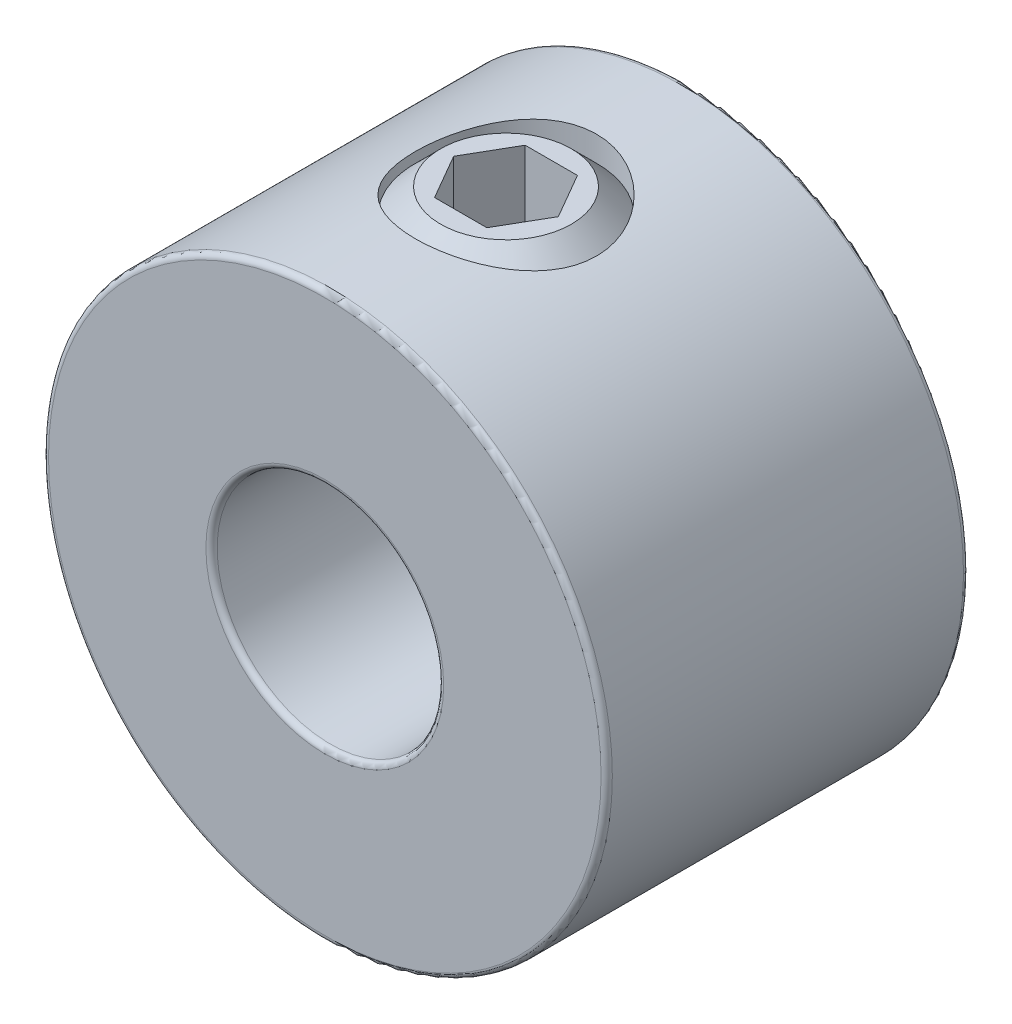
ISO-10303-21;
HEADER;
FILE_DESCRIPTION(('STEP AP214'),'2;1');
FILE_NAME('part.step','',(''),(''),'','','');
FILE_SCHEMA(('AUTOMOTIVE_DESIGN { 1 0 10303 214 1 1 1 1 }'));
ENDSEC;
DATA;
#1=APPLICATION_CONTEXT('core data for automotive mechanical design processes');
#2=APPLICATION_PROTOCOL_DEFINITION('international standard','automotive_design',2000,#1);
#3=PRODUCT_CONTEXT('',#1,'mechanical');
#4=PRODUCT('Part','Part','',(#3));
#5=PRODUCT_RELATED_PRODUCT_CATEGORY('part','',(#4));
#6=PRODUCT_DEFINITION_FORMATION('','',#4);
#7=PRODUCT_DEFINITION_CONTEXT('part definition',#1,'design');
#8=PRODUCT_DEFINITION('design','',#6,#7);
#9=PRODUCT_DEFINITION_SHAPE('','',#8);
#10=(LENGTH_UNIT() NAMED_UNIT(*) SI_UNIT(.MILLI.,.METRE.));
#11=(NAMED_UNIT(*) PLANE_ANGLE_UNIT() SI_UNIT($,.RADIAN.));
#12=(NAMED_UNIT(*) SI_UNIT($,.STERADIAN.) SOLID_ANGLE_UNIT());
#13=UNCERTAINTY_MEASURE_WITH_UNIT(LENGTH_MEASURE(1.E-05),#10,'distance_accuracy_value','');
#14=(GEOMETRIC_REPRESENTATION_CONTEXT(3) GLOBAL_UNCERTAINTY_ASSIGNED_CONTEXT((#13)) GLOBAL_UNIT_ASSIGNED_CONTEXT((#10,
#11,#12)) REPRESENTATION_CONTEXT('',''));
#15=CARTESIAN_POINT('',(0.,0.,0.));
#16=DIRECTION('',(0.,0.,1.));
#17=DIRECTION('',(1.,0.,0.));
#18=AXIS2_PLACEMENT_3D('',#15,#16,#17);
#19=CARTESIAN_POINT('',(0.,2.77962432702595,4.));
#20=DIRECTION('',(0.,1.,0.));
#21=DIRECTION('',(-1.,0.,0.));
#22=AXIS2_PLACEMENT_3D('',#19,#20,#21);
#23=CONICAL_SURFACE('',#22,2.,0.785398163397447);
#24=CARTESIAN_POINT('',(0.,2.223,4.));
#25=DIRECTION('',(0.,-1.,0.));
#26=DIRECTION('',(1.,0.,0.));
#27=AXIS2_PLACEMENT_3D('',#24,#25,#26);
#28=CIRCLE('',#27,1.44337567297406);
#29=CARTESIAN_POINT('',(1.44337567297406,2.223,4.));
#30=VERTEX_POINT('',#29);
#31=EDGE_CURVE('E12',#30,#30,#28,.T.);
#32=ORIENTED_EDGE('',*,*,#31,.F.);
#33=EDGE_LOOP('',(#32));
#34=FACE_BOUND('',#33,.T.);
#35=CARTESIAN_POINT('',(0.,2.77962432702595,4.));
#36=DIRECTION('',(0.,-1.,0.));
#37=DIRECTION('',(1.,0.,0.));
#38=AXIS2_PLACEMENT_3D('',#35,#36,#37);
#39=CIRCLE('',#38,2.);
#40=CARTESIAN_POINT('',(2.,2.77962432702595,4.));
#41=VERTEX_POINT('',#40);
#42=EDGE_CURVE('E143',#41,#41,#39,.T.);
#43=ORIENTED_EDGE('',*,*,#42,.T.);
#44=EDGE_LOOP('',(#43));
#45=FACE_BOUND('',#44,.T.);
#46=ADVANCED_FACE('F44',(#34,#45),#23,.T.);
#47=CARTESIAN_POINT('',(-0.5,2.223,4.));
#48=DIRECTION('',(0.,1.,0.));
#49=DIRECTION('',(-1.,0.,0.));
#50=AXIS2_PLACEMENT_3D('',#47,#48,#49);
#51=PLANE('',#50);
#52=CARTESIAN_POINT('',(0.,2.223,4.));
#53=DIRECTION('',(0.,-1.,0.));
#54=DIRECTION('',(1.,0.,0.));
#55=AXIS2_PLACEMENT_3D('',#52,#53,#54);
#56=CIRCLE('',#55,0.5);
#57=CARTESIAN_POINT('',(0.5,2.223,4.));
#58=VERTEX_POINT('',#57);
#59=EDGE_CURVE('E51',#58,#58,#56,.T.);
#60=ORIENTED_EDGE('',*,*,#59,.F.);
#61=EDGE_LOOP('',(#60));
#62=FACE_BOUND('',#61,.T.);
#63=ORIENTED_EDGE('',*,*,#31,.T.);
#64=EDGE_LOOP('',(#63));
#65=FACE_BOUND('',#64,.T.);
#66=ADVANCED_FACE('F163',(#62,#65),#51,.F.);
#67=CARTESIAN_POINT('',(0.,2.223,4.));
#68=DIRECTION('',(0.,-1.,0.));
#69=DIRECTION('',(1.,0.,0.));
#70=AXIS2_PLACEMENT_3D('',#67,#68,#69);
#71=CONICAL_SURFACE('',#70,0.5,0.523598775598296);
#72=CARTESIAN_POINT('',(0.,3.08902540378444,4.));
#73=VERTEX_POINT('',#72);
#74=VERTEX_LOOP('',#73);
#75=FACE_BOUND('',#74,.T.);
#76=ORIENTED_EDGE('',*,*,#59,.T.);
#77=EDGE_LOOP('',(#76));
#78=FACE_BOUND('',#77,.T.);
#79=ADVANCED_FACE('F161',(#75,#78),#71,.F.);
#80=CARTESIAN_POINT('',(0.,6.223,4.));
#81=DIRECTION('',(0.,-1.,0.));
#82=DIRECTION('',(1.,0.,0.));
#83=AXIS2_PLACEMENT_3D('',#80,#81,#82);
#84=PLANE('',#83);
#85=DIRECTION('',(0.5,0.,0.866025403784439));
#86=VECTOR('',#85,1.);
#87=CARTESIAN_POINT('',(-1.15470053837924,6.223,4.));
#88=LINE('',#87,#86);
#89=CARTESIAN_POINT('',(-1.15470053837923,6.223,4.));
#90=VERTEX_POINT('',#89);
#91=CARTESIAN_POINT('',(-0.577350269189609,6.223,5.));
#92=VERTEX_POINT('',#91);
#93=EDGE_CURVE('E131',#90,#92,#88,.T.);
#94=ORIENTED_EDGE('',*,*,#93,.F.);
#95=DIRECTION('',(-0.499999999999999,0.,0.866025403784439));
#96=VECTOR('',#95,1.);
#97=CARTESIAN_POINT('',(-0.57735026918961,6.223,3.));
#98=LINE('',#97,#96);
#99=CARTESIAN_POINT('',(-0.57735026918961,6.223,3.));
#100=VERTEX_POINT('',#99);
#101=EDGE_CURVE('E58',#100,#90,#98,.T.);
#102=ORIENTED_EDGE('',*,*,#101,.F.);
#103=DIRECTION('',(-1.,0.,0.));
#104=VECTOR('',#103,1.);
#105=CARTESIAN_POINT('',(0.577350269189642,6.223,3.));
#106=LINE('',#105,#104);
#107=CARTESIAN_POINT('',(0.577350269189642,6.223,3.));
#108=VERTEX_POINT('',#107);
#109=EDGE_CURVE('E117',#108,#100,#106,.T.);
#110=ORIENTED_EDGE('',*,*,#109,.F.);
#111=DIRECTION('',(-0.5,0.,-0.866025403784439));
#112=VECTOR('',#111,1.);
#113=CARTESIAN_POINT('',(1.15470053837927,6.223,4.));
#114=LINE('',#113,#112);
#115=CARTESIAN_POINT('',(1.15470053837927,6.223,4.));
#116=VERTEX_POINT('',#115);
#117=EDGE_CURVE('E120',#116,#108,#114,.T.);
#118=ORIENTED_EDGE('',*,*,#117,.F.);
#119=DIRECTION('',(0.499999999999999,0.,-0.866025403784439));
#120=VECTOR('',#119,1.);
#121=CARTESIAN_POINT('',(0.577350269189643,6.223,5.));
#122=LINE('',#121,#120);
#123=CARTESIAN_POINT('',(0.577350269189643,6.223,5.));
#124=VERTEX_POINT('',#123);
#125=EDGE_CURVE('E136',#124,#116,#122,.T.);
#126=ORIENTED_EDGE('',*,*,#125,.F.);
#127=DIRECTION('',(1.,0.,0.));
#128=VECTOR('',#127,1.);
#129=CARTESIAN_POINT('',(-0.577350269189609,6.223,5.));
#130=LINE('',#129,#128);
#131=EDGE_CURVE('E133',#92,#124,#130,.T.);
#132=ORIENTED_EDGE('',*,*,#131,.F.);
#133=EDGE_LOOP('',(#94,#102,#110,#118,#126,#132));
#134=FACE_BOUND('',#133,.T.);
#135=CARTESIAN_POINT('',(0.,6.223,4.));
#136=DIRECTION('',(0.,-1.,0.));
#137=DIRECTION('',(1.,0.,0.));
#138=AXIS2_PLACEMENT_3D('',#135,#136,#137);
#139=CIRCLE('',#138,1.44337567297406);
#140=CARTESIAN_POINT('',(1.44337567297406,6.223,4.));
#141=VERTEX_POINT('',#140);
#142=EDGE_CURVE('E156',#141,#141,#139,.T.);
#143=ORIENTED_EDGE('',*,*,#142,.F.);
#144=EDGE_LOOP('',(#143));
#145=FACE_BOUND('',#144,.T.);
#146=ADVANCED_FACE('F181',(#134,#145),#84,.F.);
#147=CARTESIAN_POINT('',(0.,6.223,4.));
#148=DIRECTION('',(0.,-1.,0.));
#149=DIRECTION('',(1.,0.,0.));
#150=AXIS2_PLACEMENT_3D('',#147,#148,#149);
#151=CONICAL_SURFACE('',#150,1.44337567297406,0.785398163397446);
#152=CARTESIAN_POINT('',(0.,5.66637567297405,4.));
#153=DIRECTION('',(0.,-1.,0.));
#154=DIRECTION('',(1.,0.,0.));
#155=AXIS2_PLACEMENT_3D('',#152,#153,#154);
#156=CIRCLE('',#155,2.);
#157=CARTESIAN_POINT('',(2.,5.66637567297405,4.));
#158=VERTEX_POINT('',#157);
#159=EDGE_CURVE('E153',#158,#158,#156,.T.);
#160=ORIENTED_EDGE('',*,*,#159,.F.);
#161=EDGE_LOOP('',(#160));
#162=FACE_BOUND('',#161,.T.);
#163=ORIENTED_EDGE('',*,*,#142,.T.);
#164=EDGE_LOOP('',(#163));
#165=FACE_BOUND('',#164,.T.);
#166=ADVANCED_FACE('F175',(#162,#165),#151,.T.);
#167=CARTESIAN_POINT('',(0.,3.08902540378444,4.));
#168=DIRECTION('',(0.,-1.,0.));
#169=DIRECTION('',(1.,0.,0.));
#170=AXIS2_PLACEMENT_3D('',#167,#168,#169);
#171=CYLINDRICAL_SURFACE('',#170,2.);
#172=ORIENTED_EDGE('',*,*,#42,.F.);
#173=EDGE_LOOP('',(#172));
#174=FACE_BOUND('',#173,.T.);
#175=ORIENTED_EDGE('',*,*,#159,.T.);
#176=EDGE_LOOP('',(#175));
#177=FACE_BOUND('',#176,.T.);
#178=ADVANCED_FACE('F172',(#174,#177),#171,.T.);
#179=CARTESIAN_POINT('',(-0.57735026918961,4.623,3.));
#180=DIRECTION('',(-0.866025403784439,0.,-0.5));
#181=DIRECTION('',(-0.5,0.,0.866025403784439));
#182=AXIS2_PLACEMENT_3D('',#179,#180,#181);
#183=PLANE('',#182);
#184=ORIENTED_EDGE('',*,*,#101,.T.);
#185=DIRECTION('',(0.,1.,0.));
#186=VECTOR('',#185,1.);
#187=CARTESIAN_POINT('',(-1.15470053837923,4.623,4.));
#188=LINE('',#187,#186);
#189=CARTESIAN_POINT('',(-1.15470053837923,4.623,4.));
#190=VERTEX_POINT('',#189);
#191=EDGE_CURVE('E94',#190,#90,#188,.T.);
#192=ORIENTED_EDGE('',*,*,#191,.F.);
#193=DIRECTION('',(-0.499999999999999,0.,0.866025403784439));
#194=VECTOR('',#193,1.);
#195=CARTESIAN_POINT('',(-0.57735026918961,4.623,3.));
#196=LINE('',#195,#194);
#197=CARTESIAN_POINT('',(-0.57735026918961,4.623,3.));
#198=VERTEX_POINT('',#197);
#199=EDGE_CURVE('E98',#198,#190,#196,.T.);
#200=ORIENTED_EDGE('',*,*,#199,.F.);
#201=DIRECTION('',(0.,1.,0.));
#202=VECTOR('',#201,1.);
#203=CARTESIAN_POINT('',(-0.57735026918961,4.623,3.));
#204=LINE('',#203,#202);
#205=EDGE_CURVE('E141',#198,#100,#204,.T.);
#206=ORIENTED_EDGE('',*,*,#205,.T.);
#207=EDGE_LOOP('',(#184,#192,#200,#206));
#208=FACE_BOUND('',#207,.T.);
#209=ADVANCED_FACE('F96',(#208),#183,.F.);
#210=CARTESIAN_POINT('',(0.577350269189642,4.623,3.));
#211=DIRECTION('',(0.,0.,-1.));
#212=DIRECTION('',(-1.,0.,0.));
#213=AXIS2_PLACEMENT_3D('',#210,#211,#212);
#214=PLANE('',#213);
#215=ORIENTED_EDGE('',*,*,#109,.T.);
#216=ORIENTED_EDGE('',*,*,#205,.F.);
#217=DIRECTION('',(-1.,0.,0.));
#218=VECTOR('',#217,1.);
#219=CARTESIAN_POINT('',(0.577350269189642,4.623,3.));
#220=LINE('',#219,#218);
#221=CARTESIAN_POINT('',(0.577350269189642,4.623,3.));
#222=VERTEX_POINT('',#221);
#223=EDGE_CURVE('E104',#222,#198,#220,.T.);
#224=ORIENTED_EDGE('',*,*,#223,.F.);
#225=DIRECTION('',(0.,1.,0.));
#226=VECTOR('',#225,1.);
#227=CARTESIAN_POINT('',(0.577350269189642,4.623,3.));
#228=LINE('',#227,#226);
#229=EDGE_CURVE('E144',#222,#108,#228,.T.);
#230=ORIENTED_EDGE('',*,*,#229,.T.);
#231=EDGE_LOOP('',(#215,#216,#224,#230));
#232=FACE_BOUND('',#231,.T.);
#233=ADVANCED_FACE('F195',(#232),#214,.F.);
#234=CARTESIAN_POINT('',(1.15470053837927,4.623,4.));
#235=DIRECTION('',(0.866025403784438,0.,-0.5));
#236=DIRECTION('',(-0.5,0.,-0.866025403784438));
#237=AXIS2_PLACEMENT_3D('',#234,#235,#236);
#238=PLANE('',#237);
#239=ORIENTED_EDGE('',*,*,#117,.T.);
#240=ORIENTED_EDGE('',*,*,#229,.F.);
#241=DIRECTION('',(-0.5,0.,-0.866025403784439));
#242=VECTOR('',#241,1.);
#243=CARTESIAN_POINT('',(1.15470053837927,4.623,4.));
#244=LINE('',#243,#242);
#245=CARTESIAN_POINT('',(1.15470053837927,4.623,4.));
#246=VERTEX_POINT('',#245);
#247=EDGE_CURVE('E127',#246,#222,#244,.T.);
#248=ORIENTED_EDGE('',*,*,#247,.F.);
#249=DIRECTION('',(0.,1.,0.));
#250=VECTOR('',#249,1.);
#251=CARTESIAN_POINT('',(1.15470053837927,4.623,4.));
#252=LINE('',#251,#250);
#253=EDGE_CURVE('E146',#246,#116,#252,.T.);
#254=ORIENTED_EDGE('',*,*,#253,.T.);
#255=EDGE_LOOP('',(#239,#240,#248,#254));
#256=FACE_BOUND('',#255,.T.);
#257=ADVANCED_FACE('F205',(#256),#238,.F.);
#258=CARTESIAN_POINT('',(0.577350269189643,4.623,5.));
#259=DIRECTION('',(0.866025403784439,0.,0.499999999999999));
#260=DIRECTION('',(0.499999999999999,0.,-0.866025403784439));
#261=AXIS2_PLACEMENT_3D('',#258,#259,#260);
#262=PLANE('',#261);
#263=ORIENTED_EDGE('',*,*,#125,.T.);
#264=ORIENTED_EDGE('',*,*,#253,.F.);
#265=DIRECTION('',(0.499999999999999,0.,-0.866025403784439));
#266=VECTOR('',#265,1.);
#267=CARTESIAN_POINT('',(0.577350269189643,4.623,5.));
#268=LINE('',#267,#266);
#269=CARTESIAN_POINT('',(0.577350269189643,4.623,5.));
#270=VERTEX_POINT('',#269);
#271=EDGE_CURVE('E124',#270,#246,#268,.T.);
#272=ORIENTED_EDGE('',*,*,#271,.F.);
#273=DIRECTION('',(0.,1.,0.));
#274=VECTOR('',#273,1.);
#275=CARTESIAN_POINT('',(0.577350269189643,4.623,5.));
#276=LINE('',#275,#274);
#277=EDGE_CURVE('E148',#270,#124,#276,.T.);
#278=ORIENTED_EDGE('',*,*,#277,.T.);
#279=EDGE_LOOP('',(#263,#264,#272,#278));
#280=FACE_BOUND('',#279,.T.);
#281=ADVANCED_FACE('F201',(#280),#262,.F.);
#282=CARTESIAN_POINT('',(-0.577350269189609,4.623,5.));
#283=DIRECTION('',(0.,0.,1.));
#284=DIRECTION('',(1.,0.,0.));
#285=AXIS2_PLACEMENT_3D('',#282,#283,#284);
#286=PLANE('',#285);
#287=ORIENTED_EDGE('',*,*,#131,.T.);
#288=ORIENTED_EDGE('',*,*,#277,.F.);
#289=DIRECTION('',(1.,0.,0.));
#290=VECTOR('',#289,1.);
#291=CARTESIAN_POINT('',(-0.577350269189609,4.623,5.));
#292=LINE('',#291,#290);
#293=CARTESIAN_POINT('',(-0.577350269189609,4.623,5.));
#294=VERTEX_POINT('',#293);
#295=EDGE_CURVE('E112',#294,#270,#292,.T.);
#296=ORIENTED_EDGE('',*,*,#295,.F.);
#297=DIRECTION('',(0.,1.,0.));
#298=VECTOR('',#297,1.);
#299=CARTESIAN_POINT('',(-0.577350269189609,4.623,5.));
#300=LINE('',#299,#298);
#301=EDGE_CURVE('E103',#294,#92,#300,.T.);
#302=ORIENTED_EDGE('',*,*,#301,.T.);
#303=EDGE_LOOP('',(#287,#288,#296,#302));
#304=FACE_BOUND('',#303,.T.);
#305=ADVANCED_FACE('F198',(#304),#286,.F.);
#306=CARTESIAN_POINT('',(-1.15470053837923,4.623,4.));
#307=DIRECTION('',(-0.866025403784439,0.,0.5));
#308=DIRECTION('',(0.5,0.,0.866025403784439));
#309=AXIS2_PLACEMENT_3D('',#306,#307,#308);
#310=PLANE('',#309);
#311=ORIENTED_EDGE('',*,*,#93,.T.);
#312=ORIENTED_EDGE('',*,*,#301,.F.);
#313=DIRECTION('',(0.5,0.,0.866025403784439));
#314=VECTOR('',#313,1.);
#315=CARTESIAN_POINT('',(-1.15470053837923,4.623,4.));
#316=LINE('',#315,#314);
#317=EDGE_CURVE('E107',#190,#294,#316,.T.);
#318=ORIENTED_EDGE('',*,*,#317,.F.);
#319=ORIENTED_EDGE('',*,*,#191,.T.);
#320=EDGE_LOOP('',(#311,#312,#318,#319));
#321=FACE_BOUND('',#320,.T.);
#322=ADVANCED_FACE('F108',(#321),#310,.F.);
#323=CARTESIAN_POINT('',(-0.57735026918961,4.623,3.));
#324=DIRECTION('',(0.,-1.,0.));
#325=DIRECTION('',(0.,0.,-1.));
#326=AXIS2_PLACEMENT_3D('',#323,#324,#325);
#327=PLANE('',#326);
#328=ORIENTED_EDGE('',*,*,#199,.T.);
#329=ORIENTED_EDGE('',*,*,#317,.T.);
#330=ORIENTED_EDGE('',*,*,#295,.T.);
#331=ORIENTED_EDGE('',*,*,#271,.T.);
#332=ORIENTED_EDGE('',*,*,#247,.T.);
#333=ORIENTED_EDGE('',*,*,#223,.T.);
#334=EDGE_LOOP('',(#328,#329,#330,#331,#332,#333));
#335=FACE_BOUND('',#334,.T.);
#336=ADVANCED_FACE('F114',(#335),#327,.F.);
#337=CLOSED_SHELL('',(#46,#66,#79,#146,#166,#178,#209,#233,#257,#281,#305,#322,#336));
#338=MANIFOLD_SOLID_BREP('B2',#337);
#339=CARTESIAN_POINT('',(0.,0.,8.));
#340=DIRECTION('',(0.,0.,1.));
#341=DIRECTION('',(1.,0.,0.));
#342=AXIS2_PLACEMENT_3D('',#339,#340,#341);
#343=PLANE('',#342);
#344=CARTESIAN_POINT('',(0.,0.,8.));
#345=DIRECTION('',(0.,0.,1.));
#346=DIRECTION('',(1.,0.,0.));
#347=AXIS2_PLACEMENT_3D('',#344,#345,#346);
#348=CIRCLE('',#347,2.62446);
#349=CARTESIAN_POINT('',(2.62446,0.,8.));
#350=VERTEX_POINT('',#349);
#351=EDGE_CURVE('E309',#350,#350,#348,.F.);
#352=ORIENTED_EDGE('',*,*,#351,.T.);
#353=EDGE_LOOP('',(#352));
#354=FACE_BOUND('',#353,.T.);
#355=CARTESIAN_POINT('',(0.,0.,8.));
#356=DIRECTION('',(0.,0.,1.));
#357=DIRECTION('',(1.,0.,0.));
#358=AXIS2_PLACEMENT_3D('',#355,#356,#357);
#359=CIRCLE('',#358,6.09854);
#360=CARTESIAN_POINT('',(6.09854,0.,8.));
#361=VERTEX_POINT('',#360);
#362=EDGE_CURVE('E313',#361,#361,#359,.T.);
#363=ORIENTED_EDGE('',*,*,#362,.T.);
#364=EDGE_LOOP('',(#363));
#365=FACE_BOUND('',#364,.T.);
#366=ADVANCED_FACE('F298',(#354,#365),#343,.T.);
#367=CARTESIAN_POINT('',(0.,0.,0.));
#368=DIRECTION('',(0.,0.,1.));
#369=DIRECTION('',(1.,0.,0.));
#370=AXIS2_PLACEMENT_3D('',#367,#368,#369);
#371=PLANE('',#370);
#372=CARTESIAN_POINT('',(0.,0.,0.));
#373=DIRECTION('',(0.,0.,1.));
#374=DIRECTION('',(1.,0.,0.));
#375=AXIS2_PLACEMENT_3D('',#372,#373,#374);
#376=CIRCLE('',#375,2.62446);
#377=CARTESIAN_POINT('',(2.62446,0.,0.));
#378=VERTEX_POINT('',#377);
#379=EDGE_CURVE('E324',#378,#378,#376,.T.);
#380=ORIENTED_EDGE('',*,*,#379,.T.);
#381=EDGE_LOOP('',(#380));
#382=FACE_BOUND('',#381,.T.);
#383=CARTESIAN_POINT('',(0.,0.,0.));
#384=DIRECTION('',(0.,0.,1.));
#385=DIRECTION('',(1.,0.,0.));
#386=AXIS2_PLACEMENT_3D('',#383,#384,#385);
#387=CIRCLE('',#386,6.09854);
#388=CARTESIAN_POINT('',(6.09854,0.,0.));
#389=VERTEX_POINT('',#388);
#390=EDGE_CURVE('E327',#389,#389,#387,.F.);
#391=ORIENTED_EDGE('',*,*,#390,.T.);
#392=EDGE_LOOP('',(#391));
#393=FACE_BOUND('',#392,.T.);
#394=ADVANCED_FACE('F363',(#382,#393),#371,.F.);
#395=CARTESIAN_POINT('',(0.,0.,8.));
#396=DIRECTION('',(0.,0.,-1.));
#397=DIRECTION('',(-1.,0.,0.));
#398=AXIS2_PLACEMENT_3D('',#395,#396,#397);
#399=CYLINDRICAL_SURFACE('',#398,6.223);
#400=CARTESIAN_POINT('',(0.,0.,0.12446));
#401=DIRECTION('',(0.,0.,1.));
#402=DIRECTION('',(1.,0.,0.));
#403=AXIS2_PLACEMENT_3D('',#400,#401,#402);
#404=CIRCLE('',#403,6.223);
#405=CARTESIAN_POINT('',(6.223,0.,0.12446));
#406=VERTEX_POINT('',#405);
#407=EDGE_CURVE('E43',#406,#406,#404,.T.);
#408=ORIENTED_EDGE('',*,*,#407,.T.);
#409=EDGE_LOOP('',(#408));
#410=FACE_BOUND('',#409,.T.);
#411=CARTESIAN_POINT('',(0.,0.,7.87554));
#412=DIRECTION('',(0.,0.,1.));
#413=DIRECTION('',(1.,0.,0.));
#414=AXIS2_PLACEMENT_3D('',#411,#412,#413);
#415=CIRCLE('',#414,6.223);
#416=CARTESIAN_POINT('',(6.223,0.,7.87554));
#417=VERTEX_POINT('',#416);
#418=EDGE_CURVE('E305',#417,#417,#415,.F.);
#419=ORIENTED_EDGE('',*,*,#418,.T.);
#420=EDGE_LOOP('',(#419));
#421=FACE_BOUND('',#420,.T.);
#422=CARTESIAN_POINT('',(0.,6.223,6.));
#423=CARTESIAN_POINT('',(-0.109344849387394,6.22299978665975,5.99999977489798));
#424=CARTESIAN_POINT('',(-0.218692781459291,6.22009109658988,5.99100337974367));
#425=CARTESIAN_POINT('',(-0.434181119214258,6.20877335976124,5.95535642030831));
#426=CARTESIAN_POINT('',(-0.540320962100901,6.20036335369662,5.92870277698979));
#427=CARTESIAN_POINT('',(-0.746254978622004,6.1789596626439,5.85873994432626));
#428=CARTESIAN_POINT('',(-0.846059010569927,6.16597331538662,5.81545740787444));
#429=CARTESIAN_POINT('',(-1.03699231563419,6.13675133033008,5.71358179636808));
#430=CARTESIAN_POINT('',(-1.1281200691614,6.12051512488019,5.65498604601711));
#431=CARTESIAN_POINT('',(-1.30207297370357,6.0859210774888,5.5221465807667));
#432=CARTESIAN_POINT('',(-1.38457714427325,6.0675150546903,5.44749514840338));
#433=CARTESIAN_POINT('',(-1.53613652010488,6.03092896493063,5.28553095686524));
#434=CARTESIAN_POINT('',(-1.60518903518519,6.01274894384648,5.19821567113903));
#435=CARTESIAN_POINT('',(-1.72966365707208,5.97815081340535,5.01057717812555));
#436=CARTESIAN_POINT('',(-1.7846779782155,5.96179186028481,4.90997150640143));
#437=CARTESIAN_POINT('',(-1.87687143886454,5.93341607723041,4.70032532074543));
#438=CARTESIAN_POINT('',(-1.91405558617863,5.92139802833815,4.59128718517059));
#439=CARTESIAN_POINT('',(-1.96834620759713,5.90357015871789,4.37150543613034));
#440=CARTESIAN_POINT('',(-1.98605068469726,5.897575949991,4.26092492640225));
#441=CARTESIAN_POINT('',(-2.00274819155342,5.89192783603369,4.03821305027479));
#442=CARTESIAN_POINT('',(-2.00174652862507,5.89227213243896,3.92608213277974));
#443=CARTESIAN_POINT('',(-1.98152647016485,5.89909985971348,3.70846247800211));
#444=CARTESIAN_POINT('',(-1.96307660467359,5.90532428000246,3.60289282093613));
#445=CARTESIAN_POINT('',(-1.90973314310699,5.92278886975907,3.39643507576891));
#446=CARTESIAN_POINT('',(-1.87483770722923,5.93402960040499,3.29554751285143));
#447=CARTESIAN_POINT('',(-1.78906771992137,5.96045286559087,3.09952266256469));
#448=CARTESIAN_POINT('',(-1.73795759323903,5.97569290066602,3.00449653495315));
#449=CARTESIAN_POINT('',(-1.62137261125317,6.00837220988546,2.82412128294526));
#450=CARTESIAN_POINT('',(-1.55589384607131,6.02581208208146,2.73877480210341));
#451=CARTESIAN_POINT('',(-1.40869268058695,6.0619567090307,2.57584752591708));
#452=CARTESIAN_POINT('',(-1.32633837009025,6.08068186818455,2.49884107433293));
#453=CARTESIAN_POINT('',(-1.14965263495116,6.11654669168167,2.35958789463478));
#454=CARTESIAN_POINT('',(-1.05532021868844,6.13368622455387,2.2973423897464));
#455=CARTESIAN_POINT('',(-0.856202618565597,6.16464687190223,2.18895851923819));
#456=CARTESIAN_POINT('',(-0.751334039550079,6.1784379845121,2.1429642096328));
#457=CARTESIAN_POINT('',(-0.534800588905156,6.20093089011386,2.06944318767513));
#458=CARTESIAN_POINT('',(-0.423137917751001,6.20963432132187,2.04191053031311));
#459=CARTESIAN_POINT('',(-0.20105571330985,6.22070434172252,2.00708911128014));
#460=CARTESIAN_POINT('',(-0.0907699380851832,6.22331398201422,1.99902344190777));
#461=CARTESIAN_POINT('',(0.129595004935171,6.22262546087284,2.0011649855979));
#462=CARTESIAN_POINT('',(0.239674202193011,6.21932821808903,2.01136935727004));
#463=CARTESIAN_POINT('',(0.453457311369077,6.20735646707694,2.04914122000944));
#464=CARTESIAN_POINT('',(0.557252898253722,6.19882711502416,2.07624031580869));
#465=CARTESIAN_POINT('',(0.758790022637197,6.17739795702758,2.14645495310528));
#466=CARTESIAN_POINT('',(0.856530798884324,6.16449760284564,2.18957250380183));
#467=CARTESIAN_POINT('',(1.04592864213888,6.13524101916694,2.29181195213402));
#468=CARTESIAN_POINT('',(1.13737004478324,6.11880582110077,2.35131013660381));
#469=CARTESIAN_POINT('',(1.30922810542511,6.08435252006076,2.4841744984242));
#470=CARTESIAN_POINT('',(1.38964160055392,6.06633396539199,2.5575446400417));
#471=CARTESIAN_POINT('',(1.54067591568629,6.02978798243969,2.71972514802409));
#472=CARTESIAN_POINT('',(1.61074259467564,6.01127102691286,2.80905513868796));
#473=CARTESIAN_POINT('',(1.73494866368331,5.9766089359813,2.99860592680107));
#474=CARTESIAN_POINT('',(1.78908816034081,5.96046378469671,3.0988266513261));
#475=CARTESIAN_POINT('',(1.87959837159478,5.93254487850842,3.30720368265955));
#476=CARTESIAN_POINT('',(1.91602542324932,5.92075729278412,3.41533355391342));
#477=CARTESIAN_POINT('',(1.97000995035242,5.90301727636007,3.63665321596485));
#478=CARTESIAN_POINT('',(1.98757514890403,5.89706245748546,3.74984091601367));
#479=CARTESIAN_POINT('',(2.00276218305306,5.89192072714713,3.97224303982359));
#480=CARTESIAN_POINT('',(2.00129747628637,5.89242381419158,4.08138865844239));
#481=CARTESIAN_POINT('',(1.9806894559138,5.8993824966358,4.2977947693655));
#482=CARTESIAN_POINT('',(1.96154705862451,5.90583778350546,4.40505535908594));
#483=CARTESIAN_POINT('',(1.90675366817773,5.92375080388159,4.61290948911365));
#484=CARTESIAN_POINT('',(1.87137845670831,5.93512479385707,4.71358350040568));
#485=CARTESIAN_POINT('',(1.78534317129891,5.96156814741378,4.90764656893865));
#486=CARTESIAN_POINT('',(1.73467986355987,5.97663829269412,5.00103407964489));
#487=CARTESIAN_POINT('',(1.61707665451319,6.00954748120916,5.18202502938619));
#488=CARTESIAN_POINT('',(1.54955400243415,6.0274747891065,5.2692336986395));
#489=CARTESIAN_POINT('',(1.40115724807635,6.06368806280638,5.43137792072681));
#490=CARTESIAN_POINT('',(1.32027949119129,6.08197412557138,5.50631010290422));
#491=CARTESIAN_POINT('',(1.14404065263014,6.11761812186187,5.64442647088176));
#492=CARTESIAN_POINT('',(1.04826950934142,6.13492061218506,5.70710339294272));
#493=CARTESIAN_POINT('',(0.846996878224589,6.16592819346344,5.81539079823166));
#494=CARTESIAN_POINT('',(0.741498680278147,6.17963449473287,5.86100702552094));
#495=CARTESIAN_POINT('',(0.531153554855658,6.20112990738762,5.93114495421411));
#496=CARTESIAN_POINT('',(0.426748025203916,6.20925737553202,5.95688782402648));
#497=CARTESIAN_POINT('',(0.214895516262206,6.22019191118505,5.99131348396833));
#498=CARTESIAN_POINT('',(0.10744924649515,6.22300020964178,6.00000022119965));
#499=CARTESIAN_POINT('',(0.,6.223,6.));
#500=B_SPLINE_CURVE_WITH_KNOTS('',3,(#422,#423,#424,#425,#426,#427,#428,#429,#430,#431,#432,
#433,#434,#435,#436,#437,#438,#439,#440,#441,#442,#443,#444,#445,#446,#447,#448,#449,#450,#451,
#452,#453,#454,#455,#456,#457,#458,#459,#460,#461,#462,#463,#464,#465,#466,#467,#468,#469,#470,
#471,#472,#473,#474,#475,#476,#477,#478,#479,#480,#481,#482,#483,#484,#485,#486,#487,#488,#489,
#490,#491,#492,#493,#494,#495,#496,#497,#498,#499),.UNSPECIFIED.,.T.,.F.,(4,2,2,2,2,2,2,2,2,2,2,
2,2,2,2,2,2,2,2,2,2,2,2,2,2,2,2,2,2,2,2,2,2,2,2,2,2,2,4),(0.,0.327639407022401,
0.655335962227996,0.982509459917277,1.30974015473776,1.64654627936101,1.98341969247163,
2.32918297656052,2.67484909210858,3.00957891528693,3.34421377019161,3.66476360175447,
3.98534930245345,4.31082413090024,4.63638763500672,4.97767905280872,5.31899874323022,
5.66327227698778,6.00743489468736,6.33761707041919,6.6677479000727,6.98910985916412,
7.31051214039158,7.640022094138,7.96962635651198,8.31309389598384,8.65655913574377,
8.99892466881509,9.34114996467389,9.66701129711061,9.99285573959296,10.3133583834597,
10.6339288689019,10.967657965131,11.3014785376788,11.6470670488102,11.9925391008853,
12.3145730827559,12.6365325312705),.UNSPECIFIED.);
#501=CARTESIAN_POINT('',(0.,6.223,6.));
#502=VERTEX_POINT('',#501);
#503=EDGE_CURVE('E330',#502,#502,#500,.T.);
#504=ORIENTED_EDGE('',*,*,#503,.T.);
#505=EDGE_LOOP('',(#504));
#506=FACE_BOUND('',#505,.T.);
#507=ADVANCED_FACE('F359',(#410,#421,#506),#399,.T.);
#508=CARTESIAN_POINT('',(0.,0.,8.));
#509=DIRECTION('',(0.,0.,-1.));
#510=DIRECTION('',(-1.,0.,0.));
#511=AXIS2_PLACEMENT_3D('',#508,#509,#510);
#512=CYLINDRICAL_SURFACE('',#511,2.5);
#513=CARTESIAN_POINT('',(0.,0.,0.12446));
#514=DIRECTION('',(0.,0.,1.));
#515=DIRECTION('',(1.,0.,0.));
#516=AXIS2_PLACEMENT_3D('',#513,#514,#515);
#517=CIRCLE('',#516,2.5);
#518=CARTESIAN_POINT('',(2.5,0.,0.12446));
#519=VERTEX_POINT('',#518);
#520=EDGE_CURVE('E318',#519,#519,#517,.F.);
#521=ORIENTED_EDGE('',*,*,#520,.T.);
#522=EDGE_LOOP('',(#521));
#523=FACE_BOUND('',#522,.T.);
#524=CARTESIAN_POINT('',(0.,0.,7.87554));
#525=DIRECTION('',(0.,0.,1.));
#526=DIRECTION('',(1.,0.,0.));
#527=AXIS2_PLACEMENT_3D('',#524,#525,#526);
#528=CIRCLE('',#527,2.5);
#529=CARTESIAN_POINT('',(2.5,0.,7.87554));
#530=VERTEX_POINT('',#529);
#531=EDGE_CURVE('E321',#530,#530,#528,.T.);
#532=ORIENTED_EDGE('',*,*,#531,.T.);
#533=EDGE_LOOP('',(#532));
#534=FACE_BOUND('',#533,.T.);
#535=CARTESIAN_POINT('',(0.,2.5,6.));
#536=CARTESIAN_POINT('',(-0.0959968964388691,2.49999264947401,5.99999242056707));
#537=CARTESIAN_POINT('',(-0.192133192964673,2.49441368411908,5.99303057133644));
#538=CARTESIAN_POINT('',(-0.381319365477407,2.47259269360604,5.96565005995827));
#539=CARTESIAN_POINT('',(-0.474361934321336,2.45632708000382,5.94520162873807));
#540=CARTESIAN_POINT('',(-0.654094916824507,2.4146672181517,5.89232172110493));
#541=CARTESIAN_POINT('',(-0.740821698128048,2.38933120144167,5.85996664856862));
#542=CARTESIAN_POINT('',(-0.906926323692543,2.33136010996601,5.78488265652265));
#543=CARTESIAN_POINT('',(-0.986304144671504,2.29872501207752,5.74215370414941));
#544=CARTESIAN_POINT('',(-1.16318123656703,2.21575664728952,5.63137163496894));
#545=CARTESIAN_POINT('',(-1.25736767952115,2.16321748603216,5.55968108482594));
#546=CARTESIAN_POINT('',(-1.43041367827883,2.05292192603027,5.4027219342605));
#547=CARTESIAN_POINT('',(-1.50922761533153,1.99515072200505,5.31741424649663));
#548=CARTESIAN_POINT('',(-1.6521591895554,1.87856001629835,5.13322601592733));
#549=CARTESIAN_POINT('',(-1.71602638457222,1.81973830902028,5.03415322702388));
#550=CARTESIAN_POINT('',(-1.82646834413604,1.7088210988299,4.82346121749581));
#551=CARTESIAN_POINT('',(-1.87310099386401,1.65670347089169,4.71188566611201));
#552=CARTESIAN_POINT('',(-1.93086043771819,1.58835652300928,4.52612104832302));
#553=CARTESIAN_POINT('',(-1.94865475820658,1.56628727770188,4.45618826201971));
#554=CARTESIAN_POINT('',(-1.97673396798331,1.53069889155832,4.31278731587953));
#555=CARTESIAN_POINT('',(-1.98703731881776,1.5171587417974,4.239328326475));
#556=CARTESIAN_POINT('',(-1.99939840142554,1.50084234061103,4.08980748112896));
#557=CARTESIAN_POINT('',(-2.00138345613423,1.49816096926556,4.0137285151792));
#558=CARTESIAN_POINT('',(-1.99669481699685,1.50439962302809,3.86229510796725));
#559=CARTESIAN_POINT('',(-1.99001379511087,1.51332946660241,3.7869413342337));
#560=CARTESIAN_POINT('',(-1.9669530271194,1.5432072129997,3.62777769738727));
#561=CARTESIAN_POINT('',(-1.94921808205621,1.56581842049528,3.544491993946));
#562=CARTESIAN_POINT('',(-1.90444547348848,1.61997459936279,3.38346444046296));
#563=CARTESIAN_POINT('',(-1.87738025642251,1.65154598198641,3.30573984346018));
#564=CARTESIAN_POINT('',(-1.79974102194077,1.73656116159416,3.11933789395902));
#565=CARTESIAN_POINT('',(-1.74414886595503,1.79313372968154,3.01419730169581));
#566=CARTESIAN_POINT('',(-1.61638467497537,1.90913780060687,2.81628332220066));
#567=CARTESIAN_POINT('',(-1.54418846902464,1.96857337048937,2.72352827915646));
#568=CARTESIAN_POINT('',(-1.38145818326396,2.08612751968448,2.54872522859492));
#569=CARTESIAN_POINT('',(-1.29048701026967,2.14416889260779,2.46702807769423));
#570=CARTESIAN_POINT('',(-1.09198491072666,2.25171871494995,2.31990050056569));
#571=CARTESIAN_POINT('',(-0.984499645201074,2.30124991822451,2.25442648388276));
#572=CARTESIAN_POINT('',(-0.787777814380555,2.37424585643318,2.1594371525901));
#573=CARTESIAN_POINT('',(-0.702177727329202,2.40111071224171,2.12499549556093));
#574=CARTESIAN_POINT('',(-0.524913923737149,2.44597564111417,2.06787354901203));
#575=CARTESIAN_POINT('',(-0.43325483627228,2.46398239496913,2.04518439505452));
#576=CARTESIAN_POINT('',(-0.245713233844923,2.48970335685206,2.01286145306421));
#577=CARTESIAN_POINT('',(-0.149811307212612,2.49736378633666,2.00329587525504));
#578=CARTESIAN_POINT('',(0.0426080028675219,2.50148682701864,1.99814095102371));
#579=CARTESIAN_POINT('',(0.139125268327966,2.49795152409062,2.00254900117794));
#580=CARTESIAN_POINT('',(0.321746674155466,2.48076858642945,2.02408281624768));
#581=CARTESIAN_POINT('',(0.408060891756569,2.46796352405063,2.04014917513901));
#582=CARTESIAN_POINT('',(0.576335674228724,2.43417513213473,2.08287218110156));
#583=CARTESIAN_POINT('',(0.658294938856944,2.41318937553438,2.10953197109662));
#584=CARTESIAN_POINT('',(0.821235877548912,2.36289849431328,2.17415037178393));
#585=CARTESIAN_POINT('',(0.901843619419057,2.33315912736867,2.21270578595637));
#586=CARTESIAN_POINT('',(1.05541000448331,2.26783622722139,2.29886215163279));
#587=CARTESIAN_POINT('',(1.12836826593788,2.23225240258423,2.34646355423455));
#588=CARTESIAN_POINT('',(1.27925237569143,2.14993687522397,2.45922431829688));
#589=CARTESIAN_POINT('',(1.35550718978129,2.1023696976822,2.526001690483));
#590=CARTESIAN_POINT('',(1.4965368759753,2.00443497952019,2.66938696137099));
#591=CARTESIAN_POINT('',(1.56127777727367,1.95405970991097,2.74602283683883));
#592=CARTESIAN_POINT('',(1.65568487930787,1.87374135317135,2.87643444323659));
#593=CARTESIAN_POINT('',(1.68913741792652,1.84354743685463,2.92736059075333));
#594=CARTESIAN_POINT('',(1.75155001920544,1.78435415521131,3.0326222614236));
#595=CARTESIAN_POINT('',(1.78050769868976,1.75535542951891,3.0869595718808));
#596=CARTESIAN_POINT('',(1.83358089959817,1.69983828792996,3.19887484028166));
#597=CARTESIAN_POINT('',(1.85771431687655,1.67331090774834,3.25643976724369));
#598=CARTESIAN_POINT('',(1.90088481958635,1.62410209867688,3.37500897850399));
#599=CARTESIAN_POINT('',(1.9199255893155,1.60141789380427,3.43601073751954));
#600=CARTESIAN_POINT('',(1.95360165889083,1.56019420222579,3.5660867242378));
#601=CARTESIAN_POINT('',(1.96779559724999,1.54209716714775,3.63542266494035));
#602=CARTESIAN_POINT('',(1.98878905619367,1.5149337159379,3.77683761273806));
#603=CARTESIAN_POINT('',(1.99560723074758,1.50584452307525,3.84890922045049));
#604=CARTESIAN_POINT('',(2.00132058716546,1.49824736779721,3.99434870546408));
#605=CARTESIAN_POINT('',(2.00017319779789,1.49979625918437,4.06772145415416));
#606=CARTESIAN_POINT('',(1.98996519544204,1.51330771695992,4.21298419302311));
#607=CARTESIAN_POINT('',(1.98089203653787,1.52528679347387,4.2848716473261));
#608=CARTESIAN_POINT('',(1.95207745752715,1.56207076756083,4.44460677434456));
#609=CARTESIAN_POINT('',(1.93009230408642,1.5894925841937,4.53142308249113));
#610=CARTESIAN_POINT('',(1.87608177217431,1.65288907642407,4.69863347868964));
#611=CARTESIAN_POINT('',(1.84402681542564,1.68888887211293,4.77900776003672));
#612=CARTESIAN_POINT('',(1.78094746311468,1.75491158724438,4.91217772204616));
#613=CARTESIAN_POINT('',(1.75202363190409,1.78388907325008,4.9665191815183));
#614=CARTESIAN_POINT('',(1.68964733782463,1.84307948739002,5.07183822981727));
#615=CARTESIAN_POINT('',(1.65619322765903,1.87329286211509,5.12281458495116));
#616=CARTESIAN_POINT('',(1.54918435570711,1.9643799775812,5.27077940329882));
#617=CARTESIAN_POINT('',(1.46898541640509,2.02569808481402,5.36279868666248));
#618=CARTESIAN_POINT('',(1.29001718858431,2.14418278787112,5.53338946483077));
#619=CARTESIAN_POINT('',(1.19101966157648,2.20128491964101,5.61177022423679));
#620=CARTESIAN_POINT('',(1.02998399899546,2.27874650804527,5.7155767294168));
#621=CARTESIAN_POINT('',(0.974255400199691,2.30318868109329,5.74786844413513));
#622=CARTESIAN_POINT('',(0.85885482862804,2.34866115465602,5.80736810096139));
#623=CARTESIAN_POINT('',(0.799185299805358,2.36969354228912,5.83457915448451));
#624=CARTESIAN_POINT('',(0.655037739424243,2.41420905511499,5.89178005989561));
#625=CARTESIAN_POINT('',(0.569110239590115,2.43602892887628,5.91948267180093));
#626=CARTESIAN_POINT('',(0.392713097427717,2.47058864976841,5.96315767338771));
#627=CARTESIAN_POINT('',(0.302256024103133,2.48335227816872,5.9791607887746));
#628=CARTESIAN_POINT('',(0.175880930919907,2.49405378309104,5.9925630255603));
#629=CARTESIAN_POINT('',(0.140808552821268,2.49627918763429,5.99534737874577));
#630=CARTESIAN_POINT('',(0.0704970748918256,2.499253810179,5.99906746352746));
#631=CARTESIAN_POINT('',(0.035257939711733,2.50000269971647,6.00000278378988));
#632=CARTESIAN_POINT('',(0.,2.5,6.));
#633=B_SPLINE_CURVE_WITH_KNOTS('',3,(#535,#536,#537,#538,#539,#540,#541,#542,#543,#544,#545,
#546,#547,#548,#549,#550,#551,#552,#553,#554,#555,#556,#557,#558,#559,#560,#561,#562,#563,#564,
#565,#566,#567,#568,#569,#570,#571,#572,#573,#574,#575,#576,#577,#578,#579,#580,#581,#582,#583,
#584,#585,#586,#587,#588,#589,#590,#591,#592,#593,#594,#595,#596,#597,#598,#599,#600,#601,#602,
#603,#604,#605,#606,#607,#608,#609,#610,#611,#612,#613,#614,#615,#616,#617,#618,#619,#620,#621,
#622,#623,#624,#625,#626,#627,#628,#629,#630,#631,#632),.UNSPECIFIED.,.T.,.F.,(4,2,2,2,2,2,2,2,
2,2,2,2,2,2,2,2,2,2,2,2,2,2,2,2,2,2,2,2,2,2,2,2,2,2,2,2,2,2,2,2,2,2,2,2,2,2,2,2,4),(0.,
0.287836605992208,0.576310692639342,0.862965057250604,1.14962032997081,1.53607888200101,
1.92366738187851,2.31734741765481,2.70969292925127,2.9353448634113,3.16043877408111,
3.38749528500759,3.61474392028823,3.87758630032011,4.14121163495706,4.53425748188301,
4.92787915886674,5.3319817328842,5.73498644040677,6.02213978124802,6.30907621738868,
6.59749843639965,6.88586692268771,7.15087004938159,7.41595185759573,7.69742753051566,
7.9789172435135,8.31365537249325,8.64936529970902,8.85316560745906,9.05707360380851,
9.26021055202079,9.46320013996582,9.68152133432596,9.89928907450684,10.1182215471168,
10.3375012031536,10.616933053181,10.8971934831173,11.1010640012511,11.3050088506911,
11.7129165318148,12.1261363563906,12.3324811048119,12.5386990694968,12.8161540735935,
13.0928777702216,13.1985714874516,13.3042887145431),.UNSPECIFIED.);
#634=CARTESIAN_POINT('',(0.,2.5,6.));
#635=VERTEX_POINT('',#634);
#636=EDGE_CURVE('E331',#635,#635,#633,.T.);
#637=ORIENTED_EDGE('',*,*,#636,.F.);
#638=EDGE_LOOP('',(#637));
#639=FACE_BOUND('',#638,.T.);
#640=ADVANCED_FACE('F343',(#523,#534,#639),#512,.F.);
#641=CARTESIAN_POINT('',(0.,-5.65685424949238,4.));
#642=DIRECTION('',(0.,1.,0.));
#643=DIRECTION('',(0.,0.,1.));
#644=AXIS2_PLACEMENT_3D('',#641,#642,#643);
#645=CYLINDRICAL_SURFACE('',#644,2.);
#646=ORIENTED_EDGE('',*,*,#636,.T.);
#647=EDGE_LOOP('',(#646));
#648=FACE_BOUND('',#647,.T.);
#649=ORIENTED_EDGE('',*,*,#503,.F.);
#650=EDGE_LOOP('',(#649));
#651=FACE_BOUND('',#650,.T.);
#652=ADVANCED_FACE('F346',(#648,#651),#645,.F.);
#653=CARTESIAN_POINT('',(0.,0.,0.12446));
#654=DIRECTION('',(0.,0.,1.));
#655=DIRECTION('',(1.,0.,0.));
#656=AXIS2_PLACEMENT_3D('',#653,#654,#655);
#657=TOROIDAL_SURFACE('',#656,2.62446,0.12446);
#658=ORIENTED_EDGE('',*,*,#520,.F.);
#659=EDGE_LOOP('',(#658));
#660=FACE_BOUND('',#659,.T.);
#661=ORIENTED_EDGE('',*,*,#379,.F.);
#662=EDGE_LOOP('',(#661));
#663=FACE_BOUND('',#662,.T.);
#664=ADVANCED_FACE('F349',(#660,#663),#657,.T.);
#665=CARTESIAN_POINT('',(0.,0.,7.87554));
#666=DIRECTION('',(0.,0.,1.));
#667=DIRECTION('',(1.,0.,0.));
#668=AXIS2_PLACEMENT_3D('',#665,#666,#667);
#669=TOROIDAL_SURFACE('',#668,2.62446,0.12446);
#670=ORIENTED_EDGE('',*,*,#351,.F.);
#671=EDGE_LOOP('',(#670));
#672=FACE_BOUND('',#671,.T.);
#673=ORIENTED_EDGE('',*,*,#531,.F.);
#674=EDGE_LOOP('',(#673));
#675=FACE_BOUND('',#674,.T.);
#676=ADVANCED_FACE('F356',(#672,#675),#669,.T.);
#677=CARTESIAN_POINT('',(0.,0.,0.12446));
#678=DIRECTION('',(0.,0.,1.));
#679=DIRECTION('',(1.,0.,0.));
#680=AXIS2_PLACEMENT_3D('',#677,#678,#679);
#681=TOROIDAL_SURFACE('',#680,6.09854,0.12446);
#682=ORIENTED_EDGE('',*,*,#390,.F.);
#683=EDGE_LOOP('',(#682));
#684=FACE_BOUND('',#683,.T.);
#685=ORIENTED_EDGE('',*,*,#407,.F.);
#686=EDGE_LOOP('',(#685));
#687=FACE_BOUND('',#686,.T.);
#688=ADVANCED_FACE('F375',(#684,#687),#681,.T.);
#689=CARTESIAN_POINT('',(0.,0.,7.87554));
#690=DIRECTION('',(0.,0.,1.));
#691=DIRECTION('',(1.,0.,0.));
#692=AXIS2_PLACEMENT_3D('',#689,#690,#691);
#693=TOROIDAL_SURFACE('',#692,6.09854,0.12446);
#694=ORIENTED_EDGE('',*,*,#418,.F.);
#695=EDGE_LOOP('',(#694));
#696=FACE_BOUND('',#695,.T.);
#697=ORIENTED_EDGE('',*,*,#362,.F.);
#698=EDGE_LOOP('',(#697));
#699=FACE_BOUND('',#698,.T.);
#700=ADVANCED_FACE('F300',(#696,#699),#693,.T.);
#701=CLOSED_SHELL('',(#366,#394,#507,#640,#652,#664,#676,#688,#700));
#702=MANIFOLD_SOLID_BREP('B6',#701);
#703=ADVANCED_BREP_SHAPE_REPRESENTATION('',(#18,#338,#702),#14);
#704=SHAPE_DEFINITION_REPRESENTATION(#9,#703);
ENDSEC;
END-ISO-10303-21;
